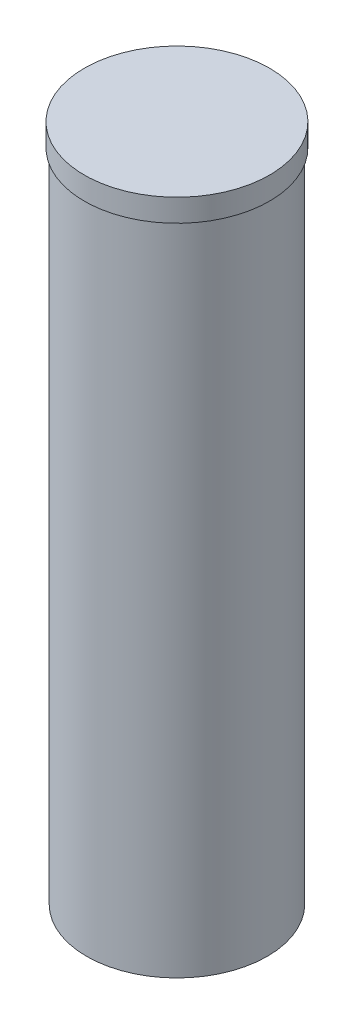
ISO-10303-21;
HEADER;
FILE_DESCRIPTION(('STEP AP214'),'2;1');
FILE_NAME('part.step','',(''),(''),'','','');
FILE_SCHEMA(('AUTOMOTIVE_DESIGN { 1 0 10303 214 1 1 1 1 }'));
ENDSEC;
DATA;
#1=APPLICATION_CONTEXT('core data for automotive mechanical design processes');
#2=APPLICATION_PROTOCOL_DEFINITION('international standard','automotive_design',2000,#1);
#3=PRODUCT_CONTEXT('',#1,'mechanical');
#4=PRODUCT('Part','Part','',(#3));
#5=PRODUCT_RELATED_PRODUCT_CATEGORY('part','',(#4));
#6=PRODUCT_DEFINITION_FORMATION('','',#4);
#7=PRODUCT_DEFINITION_CONTEXT('part definition',#1,'design');
#8=PRODUCT_DEFINITION('design','',#6,#7);
#9=PRODUCT_DEFINITION_SHAPE('','',#8);
#10=(LENGTH_UNIT() NAMED_UNIT(*) SI_UNIT(.MILLI.,.METRE.));
#11=(NAMED_UNIT(*) PLANE_ANGLE_UNIT() SI_UNIT($,.RADIAN.));
#12=(NAMED_UNIT(*) SI_UNIT($,.STERADIAN.) SOLID_ANGLE_UNIT());
#13=UNCERTAINTY_MEASURE_WITH_UNIT(LENGTH_MEASURE(1.E-05),#10,'distance_accuracy_value','');
#14=(GEOMETRIC_REPRESENTATION_CONTEXT(3) GLOBAL_UNCERTAINTY_ASSIGNED_CONTEXT((#13)) GLOBAL_UNIT_ASSIGNED_CONTEXT((#10,
#11,#12)) REPRESENTATION_CONTEXT('',''));
#15=CARTESIAN_POINT('',(0.,0.,0.));
#16=DIRECTION('',(0.,0.,1.));
#17=DIRECTION('',(1.,0.,0.));
#18=AXIS2_PLACEMENT_3D('',#15,#16,#17);
#19=CARTESIAN_POINT('',(0.,150.,0.));
#20=DIRECTION('',(0.,-1.,0.));
#21=DIRECTION('',(0.,0.,-1.));
#22=AXIS2_PLACEMENT_3D('',#19,#20,#21);
#23=PLANE('',#22);
#24=CARTESIAN_POINT('',(0.,150.,0.));
#25=DIRECTION('',(0.,-1.,0.));
#26=DIRECTION('',(0.,0.,-1.));
#27=AXIS2_PLACEMENT_3D('',#24,#25,#26);
#28=CIRCLE('',#27,20.5);
#29=CARTESIAN_POINT('',(0.,150.,-20.5));
#30=VERTEX_POINT('',#29);
#31=EDGE_CURVE('E53',#30,#30,#28,.T.);
#32=ORIENTED_EDGE('',*,*,#31,.F.);
#33=EDGE_LOOP('',(#32));
#34=FACE_BOUND('',#33,.T.);
#35=ADVANCED_FACE('F39',(#34),#23,.F.);
#36=CARTESIAN_POINT('',(0.,0.,0.));
#37=DIRECTION('',(0.,-1.,0.));
#38=DIRECTION('',(0.,0.,-1.));
#39=AXIS2_PLACEMENT_3D('',#36,#37,#38);
#40=PLANE('',#39);
#41=CARTESIAN_POINT('',(0.,0.,0.));
#42=DIRECTION('',(0.,-1.,0.));
#43=DIRECTION('',(0.,0.,-1.));
#44=AXIS2_PLACEMENT_3D('',#41,#42,#43);
#45=CIRCLE('',#44,20.);
#46=CARTESIAN_POINT('',(0.,0.,-20.));
#47=VERTEX_POINT('',#46);
#48=EDGE_CURVE('E47',#47,#47,#45,.T.);
#49=ORIENTED_EDGE('',*,*,#48,.T.);
#50=EDGE_LOOP('',(#49));
#51=FACE_BOUND('',#50,.T.);
#52=ADVANCED_FACE('F68',(#51),#40,.T.);
#53=CARTESIAN_POINT('',(0.,0.,0.));
#54=DIRECTION('',(0.,-1.,0.));
#55=DIRECTION('',(0.,0.,-1.));
#56=AXIS2_PLACEMENT_3D('',#53,#54,#55);
#57=CYLINDRICAL_SURFACE('',#56,20.);
#58=CARTESIAN_POINT('',(0.,145.,0.));
#59=DIRECTION('',(0.,-1.,0.));
#60=DIRECTION('',(0.,0.,-1.));
#61=AXIS2_PLACEMENT_3D('',#58,#59,#60);
#62=CIRCLE('',#61,20.);
#63=CARTESIAN_POINT('',(0.,145.,-20.));
#64=VERTEX_POINT('',#63);
#65=EDGE_CURVE('E10',#64,#64,#62,.F.);
#66=ORIENTED_EDGE('',*,*,#65,.F.);
#67=EDGE_LOOP('',(#66));
#68=FACE_BOUND('',#67,.T.);
#69=ORIENTED_EDGE('',*,*,#48,.F.);
#70=EDGE_LOOP('',(#69));
#71=FACE_BOUND('',#70,.T.);
#72=ADVANCED_FACE('F63',(#68,#71),#57,.T.);
#73=CARTESIAN_POINT('',(0.,0.,0.));
#74=DIRECTION('',(0.,-1.,0.));
#75=DIRECTION('',(0.,0.,-1.));
#76=AXIS2_PLACEMENT_3D('',#73,#74,#75);
#77=CYLINDRICAL_SURFACE('',#76,20.5);
#78=CARTESIAN_POINT('',(0.,145.,0.));
#79=DIRECTION('',(0.,-1.,0.));
#80=DIRECTION('',(0.,0.,-1.));
#81=AXIS2_PLACEMENT_3D('',#78,#79,#80);
#82=CIRCLE('',#81,20.5);
#83=CARTESIAN_POINT('',(0.,145.,-20.5));
#84=VERTEX_POINT('',#83);
#85=EDGE_CURVE('E43',#84,#84,#82,.T.);
#86=ORIENTED_EDGE('',*,*,#85,.F.);
#87=EDGE_LOOP('',(#86));
#88=FACE_BOUND('',#87,.T.);
#89=ORIENTED_EDGE('',*,*,#31,.T.);
#90=EDGE_LOOP('',(#89));
#91=FACE_BOUND('',#90,.T.);
#92=ADVANCED_FACE('F61',(#88,#91),#77,.T.);
#93=CARTESIAN_POINT('',(20.,145.,0.));
#94=DIRECTION('',(0.,-1.,0.));
#95=DIRECTION('',(0.,0.,-1.));
#96=AXIS2_PLACEMENT_3D('',#93,#94,#95);
#97=PLANE('',#96);
#98=ORIENTED_EDGE('',*,*,#85,.T.);
#99=EDGE_LOOP('',(#98));
#100=FACE_BOUND('',#99,.T.);
#101=ORIENTED_EDGE('',*,*,#65,.T.);
#102=EDGE_LOOP('',(#101));
#103=FACE_BOUND('',#102,.T.);
#104=ADVANCED_FACE('F41',(#100,#103),#97,.T.);
#105=CLOSED_SHELL('',(#35,#52,#72,#92,#104));
#106=MANIFOLD_SOLID_BREP('B2',#105);
#107=ADVANCED_BREP_SHAPE_REPRESENTATION('',(#18,#106),#14);
#108=SHAPE_DEFINITION_REPRESENTATION(#9,#107);
ENDSEC;
END-ISO-10303-21;
